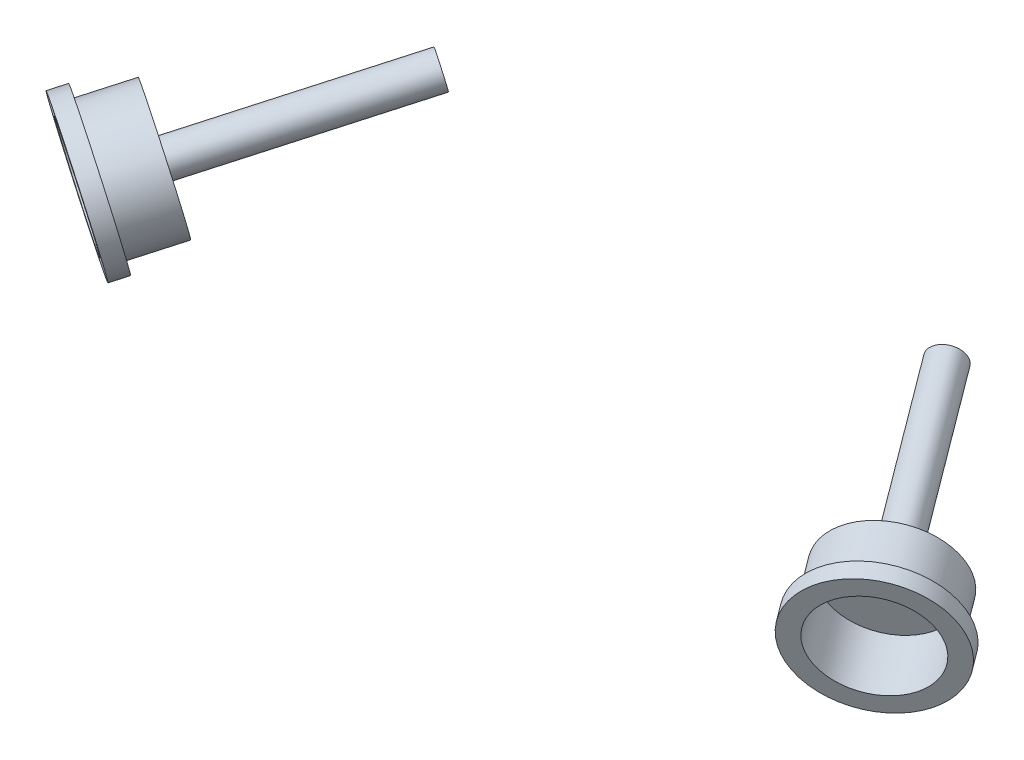
ISO-10303-21;
HEADER;
FILE_DESCRIPTION(('STEP AP214'),'2;1');
FILE_NAME('part.step','',(''),(''),'','','');
FILE_SCHEMA(('AUTOMOTIVE_DESIGN { 1 0 10303 214 1 1 1 1 }'));
ENDSEC;
DATA;
#1=APPLICATION_CONTEXT('core data for automotive mechanical design processes');
#2=APPLICATION_PROTOCOL_DEFINITION('international standard','automotive_design',2000,#1);
#3=PRODUCT_CONTEXT('',#1,'mechanical');
#4=PRODUCT('Part','Part','',(#3));
#5=PRODUCT_RELATED_PRODUCT_CATEGORY('part','',(#4));
#6=PRODUCT_DEFINITION_FORMATION('','',#4);
#7=PRODUCT_DEFINITION_CONTEXT('part definition',#1,'design');
#8=PRODUCT_DEFINITION('design','',#6,#7);
#9=PRODUCT_DEFINITION_SHAPE('','',#8);
#10=(LENGTH_UNIT() NAMED_UNIT(*) SI_UNIT(.MILLI.,.METRE.));
#11=(NAMED_UNIT(*) PLANE_ANGLE_UNIT() SI_UNIT($,.RADIAN.));
#12=(NAMED_UNIT(*) SI_UNIT($,.STERADIAN.) SOLID_ANGLE_UNIT());
#13=UNCERTAINTY_MEASURE_WITH_UNIT(LENGTH_MEASURE(1.E-05),#10,'distance_accuracy_value','');
#14=(GEOMETRIC_REPRESENTATION_CONTEXT(3) GLOBAL_UNCERTAINTY_ASSIGNED_CONTEXT((#13)) GLOBAL_UNIT_ASSIGNED_CONTEXT((#10,
#11,#12)) REPRESENTATION_CONTEXT('',''));
#15=CARTESIAN_POINT('',(0.,0.,0.));
#16=DIRECTION('',(0.,0.,1.));
#17=DIRECTION('',(1.,0.,0.));
#18=AXIS2_PLACEMENT_3D('',#15,#16,#17);
#19=CARTESIAN_POINT('',(7.10329401750734,-3.17987861259268,10.6383531296635));
#20=DIRECTION('',(0.538897500357627,-0.241244221560213,0.807087795516763));
#21=DIRECTION('',(-0.0886985432402282,0.936537053099896,0.339162080129877));
#22=AXIS2_PLACEMENT_3D('',#19,#20,#21);
#23=CYLINDRICAL_SURFACE('',#22,0.26);
#24=CARTESIAN_POINT('',(4.50041909078,-2.01466902245686,6.74011907731756));
#25=DIRECTION('',(0.538897500357627,-0.241244221560213,0.807087795516763));
#26=DIRECTION('',(-0.0886985432402282,0.936537053099896,0.339162080129877));
#27=AXIS2_PLACEMENT_3D('',#24,#25,#26);
#28=CIRCLE('',#27,0.26);
#29=CARTESIAN_POINT('',(4.47735746953754,-1.77116938865088,6.82830121815133));
#30=VERTEX_POINT('',#29);
#31=EDGE_CURVE('P0_E10',#30,#30,#28,.T.);
#32=ORIENTED_EDGE('',*,*,#31,.F.);
#33=EDGE_LOOP('',(#32));
#34=FACE_BOUND('',#33,.T.);
#35=CARTESIAN_POINT('',(6.55361856714256,-2.93380950660127,9.81512357823643));
#36=DIRECTION('',(0.538897500357627,-0.241244221560213,0.807087795516763));
#37=DIRECTION('',(-0.0886985432402282,0.936537053099896,0.339162080129877));
#38=AXIS2_PLACEMENT_3D('',#35,#36,#37);
#39=CIRCLE('',#38,0.26);
#40=CARTESIAN_POINT('',(6.5305569459001,-2.69030987279529,9.9033057190702));
#41=VERTEX_POINT('',#40);
#42=EDGE_CURVE('P0_E49',#41,#41,#39,.T.);
#43=ORIENTED_EDGE('',*,*,#42,.T.);
#44=EDGE_LOOP('',(#43));
#45=FACE_BOUND('',#44,.T.);
#46=ADVANCED_FACE('P0_F15',(#34,#45),#23,.F.);
#47=CARTESIAN_POINT('',(4.52348071202246,-2.25816865626283,6.65193693648379));
#48=DIRECTION('',(0.538897500357627,-0.241244221560213,0.807087795516763));
#49=DIRECTION('',(-0.0886985432402282,0.936537053099896,0.339162080129877));
#50=AXIS2_PLACEMENT_3D('',#47,#48,#49);
#51=PLANE('',#50);
#52=CARTESIAN_POINT('',(4.50041909078,-2.01466902245686,6.74011907731756));
#53=DIRECTION('',(0.538897500357627,-0.241244221560213,0.807087795516763));
#54=DIRECTION('',(-0.0886985432402282,0.936537053099896,0.339162080129877));
#55=AXIS2_PLACEMENT_3D('',#52,#53,#54);
#56=CIRCLE('',#55,0.3);
#57=CARTESIAN_POINT('',(4.47380952780793,-1.73370790652689,6.84186770135653));
#58=VERTEX_POINT('',#57);
#59=EDGE_CURVE('P0_E21',#58,#58,#56,.T.);
#60=ORIENTED_EDGE('',*,*,#59,.F.);
#61=EDGE_LOOP('',(#60));
#62=FACE_BOUND('',#61,.T.);
#63=ORIENTED_EDGE('',*,*,#31,.T.);
#64=EDGE_LOOP('',(#63));
#65=FACE_BOUND('',#64,.T.);
#66=ADVANCED_FACE('P0_F98',(#62,#65),#51,.F.);
#67=CARTESIAN_POINT('',(7.10329401750734,-3.17987861259268,10.6383531296635));
#68=DIRECTION('',(0.538897500357627,-0.241244221560213,0.807087795516763));
#69=DIRECTION('',(-0.0886985432402282,0.936537053099896,0.339162080129877));
#70=AXIS2_PLACEMENT_3D('',#67,#68,#69);
#71=CYLINDRICAL_SURFACE('',#70,0.3);
#72=CARTESIAN_POINT('',(6.47817291709249,-2.90003531558284,9.70213128686408));
#73=DIRECTION('',(0.538897500357627,-0.241244221560213,0.807087795516763));
#74=DIRECTION('',(-0.0886985432402282,0.936537053099896,0.339162080129877));
#75=AXIS2_PLACEMENT_3D('',#72,#73,#74);
#76=CIRCLE('',#75,0.3);
#77=CARTESIAN_POINT('',(6.45156335412042,-2.61907419965287,9.80387991090305));
#78=VERTEX_POINT('',#77);
#79=EDGE_CURVE('P0_E25',#78,#78,#76,.T.);
#80=ORIENTED_EDGE('',*,*,#79,.F.);
#81=EDGE_LOOP('',(#80));
#82=FACE_BOUND('',#81,.T.);
#83=ORIENTED_EDGE('',*,*,#59,.T.);
#84=EDGE_LOOP('',(#83));
#85=FACE_BOUND('',#84,.T.);
#86=ADVANCED_FACE('P0_F93',(#82,#85),#71,.T.);
#87=CARTESIAN_POINT('',(6.50478248006456,-3.18099643151281,9.60038266282512));
#88=DIRECTION('',(0.538897500357627,-0.241244221560213,0.807087795516763));
#89=DIRECTION('',(-0.0886985432402282,0.936537053099896,0.339162080129877));
#90=AXIS2_PLACEMENT_3D('',#87,#88,#89);
#91=PLANE('',#90);
#92=CARTESIAN_POINT('',(6.47817291709249,-2.90003531558284,9.70213128686408));
#93=DIRECTION('',(0.538897500357627,-0.241244221560213,0.807087795516763));
#94=DIRECTION('',(-0.0886985432402282,0.936537053099896,0.339162080129877));
#95=AXIS2_PLACEMENT_3D('',#92,#93,#94);
#96=CIRCLE('',#95,1.08);
#97=CARTESIAN_POINT('',(6.38237849039304,-1.88857529823495,10.0684263334044));
#98=VERTEX_POINT('',#97);
#99=EDGE_CURVE('P0_E29',#98,#98,#96,.T.);
#100=ORIENTED_EDGE('',*,*,#99,.F.);
#101=EDGE_LOOP('',(#100));
#102=FACE_BOUND('',#101,.T.);
#103=ORIENTED_EDGE('',*,*,#79,.T.);
#104=EDGE_LOOP('',(#103));
#105=FACE_BOUND('',#104,.T.);
#106=ADVANCED_FACE('P0_F87',(#102,#105),#91,.F.);
#107=CARTESIAN_POINT('',(7.10329401750734,-3.17987861259268,10.6383531296635));
#108=DIRECTION('',(0.538897500357627,-0.241244221560213,0.807087795516763));
#109=DIRECTION('',(-0.0886985432402282,0.936537053099896,0.339162080129877));
#110=AXIS2_PLACEMENT_3D('',#107,#108,#109);
#111=CYLINDRICAL_SURFACE('',#110,1.08);
#112=CARTESIAN_POINT('',(6.94162476740005,-3.10750534612462,10.3962267910085));
#113=DIRECTION('',(0.538897500357627,-0.241244221560213,0.807087795516763));
#114=DIRECTION('',(-0.0886985432402282,0.936537053099896,0.339162080129877));
#115=AXIS2_PLACEMENT_3D('',#112,#113,#114);
#116=CIRCLE('',#115,1.08);
#117=CARTESIAN_POINT('',(6.8458303407006,-2.09604532877673,10.7625218375488));
#118=VERTEX_POINT('',#117);
#119=EDGE_CURVE('P0_E34',#118,#118,#116,.T.);
#120=ORIENTED_EDGE('',*,*,#119,.F.);
#121=EDGE_LOOP('',(#120));
#122=FACE_BOUND('',#121,.T.);
#123=ORIENTED_EDGE('',*,*,#99,.T.);
#124=EDGE_LOOP('',(#123));
#125=FACE_BOUND('',#124,.T.);
#126=ADVANCED_FACE('P0_F81',(#122,#125),#111,.T.);
#127=CARTESIAN_POINT('',(7.0374191940995,-4.11896536347251,10.0299317444682));
#128=DIRECTION('',(0.538897500357627,-0.241244221560213,0.807087795516763));
#129=DIRECTION('',(-0.0886985432402282,0.936537053099896,0.339162080129877));
#130=AXIS2_PLACEMENT_3D('',#127,#128,#129);
#131=PLANE('',#130);
#132=CARTESIAN_POINT('',(6.94162476740005,-3.10750534612462,10.3962267910085));
#133=DIRECTION('',(0.538897500357627,-0.241244221560213,0.807087795516763));
#134=DIRECTION('',(-0.0886985432402282,0.936537053099896,0.339162080129877));
#135=AXIS2_PLACEMENT_3D('',#132,#133,#134);
#136=CIRCLE('',#135,1.275);
#137=CARTESIAN_POINT('',(6.82853412476876,-1.91342060342225,10.8286584431741));
#138=VERTEX_POINT('',#137);
#139=EDGE_CURVE('P0_E37',#138,#138,#136,.T.);
#140=ORIENTED_EDGE('',*,*,#139,.F.);
#141=EDGE_LOOP('',(#140));
#142=FACE_BOUND('',#141,.T.);
#143=ORIENTED_EDGE('',*,*,#119,.T.);
#144=EDGE_LOOP('',(#143));
#145=FACE_BOUND('',#144,.T.);
#146=ADVANCED_FACE('P0_F75',(#142,#145),#131,.F.);
#147=CARTESIAN_POINT('',(7.10329401750734,-3.17987861259268,10.6383531296635));
#148=DIRECTION('',(0.538897500357627,-0.241244221560213,0.807087795516763));
#149=DIRECTION('',(-0.0886985432402282,0.936537053099896,0.339162080129877));
#150=AXIS2_PLACEMENT_3D('',#147,#148,#149);
#151=CYLINDRICAL_SURFACE('',#150,1.275);
#152=CARTESIAN_POINT('',(7.10329401750734,-3.17987861259268,10.6383531296635));
#153=DIRECTION('',(0.538897500357627,-0.241244221560213,0.807087795516763));
#154=DIRECTION('',(-0.0886985432402282,0.936537053099896,0.339162080129877));
#155=AXIS2_PLACEMENT_3D('',#152,#153,#154);
#156=CIRCLE('',#155,1.275);
#157=CARTESIAN_POINT('',(6.99020337487605,-1.98579386989032,11.0707847818291));
#158=VERTEX_POINT('',#157);
#159=EDGE_CURVE('P0_E40',#158,#158,#156,.T.);
#160=ORIENTED_EDGE('',*,*,#159,.F.);
#161=EDGE_LOOP('',(#160));
#162=FACE_BOUND('',#161,.T.);
#163=ORIENTED_EDGE('',*,*,#139,.T.);
#164=EDGE_LOOP('',(#163));
#165=FACE_BOUND('',#164,.T.);
#166=ADVANCED_FACE('P0_F69',(#162,#165),#151,.T.);
#167=CARTESIAN_POINT('',(7.21638466013863,-4.37396335529505,10.2059214774979));
#168=DIRECTION('',(-0.538897500357627,0.241244221560213,-0.807087795516763));
#169=DIRECTION('',(0.0886985432402282,-0.936537053099896,-0.339162080129877));
#170=AXIS2_PLACEMENT_3D('',#167,#168,#169);
#171=PLANE('',#170);
#172=CARTESIAN_POINT('',(7.10329401750734,-3.17987861259268,10.6383531296635));
#173=DIRECTION('',(0.538897500357627,-0.241244221560213,0.807087795516763));
#174=DIRECTION('',(-0.0886985432402282,0.936537053099896,0.339162080129877));
#175=AXIS2_PLACEMENT_3D('',#172,#173,#174);
#176=CIRCLE('',#175,0.945);
#177=CARTESIAN_POINT('',(7.01947389414532,-2.29485109741328,10.9588612953863));
#178=VERTEX_POINT('',#177);
#179=EDGE_CURVE('P0_E43',#178,#178,#176,.T.);
#180=ORIENTED_EDGE('',*,*,#179,.F.);
#181=EDGE_LOOP('',(#180));
#182=FACE_BOUND('',#181,.T.);
#183=ORIENTED_EDGE('',*,*,#159,.T.);
#184=EDGE_LOOP('',(#183));
#185=FACE_BOUND('',#184,.T.);
#186=ADVANCED_FACE('P0_F63',(#182,#185),#171,.F.);
#187=CARTESIAN_POINT('',(7.10329401750734,-3.17987861259268,10.6383531296635));
#188=DIRECTION('',(0.538897500357627,-0.241244221560213,0.807087795516763));
#189=DIRECTION('',(-0.0886985432402282,0.936537053099896,0.339162080129877));
#190=AXIS2_PLACEMENT_3D('',#187,#188,#189);
#191=CYLINDRICAL_SURFACE('',#190,0.945);
#192=CARTESIAN_POINT('',(6.55361856714256,-2.93380950660127,9.81512357823643));
#193=DIRECTION('',(0.538897500357627,-0.241244221560213,0.807087795516763));
#194=DIRECTION('',(-0.0886985432402282,0.936537053099896,0.339162080129877));
#195=AXIS2_PLACEMENT_3D('',#192,#193,#194);
#196=CIRCLE('',#195,0.945);
#197=CARTESIAN_POINT('',(6.46979844378054,-2.04878199142187,10.1356317439592));
#198=VERTEX_POINT('',#197);
#199=EDGE_CURVE('P0_E46',#198,#198,#196,.T.);
#200=ORIENTED_EDGE('',*,*,#199,.F.);
#201=EDGE_LOOP('',(#200));
#202=FACE_BOUND('',#201,.T.);
#203=ORIENTED_EDGE('',*,*,#179,.T.);
#204=EDGE_LOOP('',(#203));
#205=FACE_BOUND('',#204,.T.);
#206=ADVANCED_FACE('P0_F57',(#202,#205),#191,.F.);
#207=CARTESIAN_POINT('',(6.63743869050457,-3.81883702178067,9.4946154125137));
#208=DIRECTION('',(-0.538897500357627,0.241244221560213,-0.807087795516763));
#209=DIRECTION('',(0.0886985432402282,-0.936537053099896,-0.339162080129877));
#210=AXIS2_PLACEMENT_3D('',#207,#208,#209);
#211=PLANE('',#210);
#212=ORIENTED_EDGE('',*,*,#42,.F.);
#213=EDGE_LOOP('',(#212));
#214=FACE_BOUND('',#213,.T.);
#215=ORIENTED_EDGE('',*,*,#199,.T.);
#216=EDGE_LOOP('',(#215));
#217=FACE_BOUND('',#216,.T.);
#218=ADVANCED_FACE('P0_F54',(#214,#217),#211,.F.);
#219=CLOSED_SHELL('',(#46,#66,#86,#106,#126,#146,#166,#186,#206,#218));
#220=MANIFOLD_SOLID_BREP('P0_B1',#219);
#221=CARTESIAN_POINT('',(-7.11266514827799,-3.18407371675702,10.6523879419797));
#222=DIRECTION('',(-0.538897500357627,-0.241244221560212,0.807087795516763));
#223=DIRECTION('',(-0.234853213870572,-0.877095865970433,-0.418983066283401));
#224=AXIS2_PLACEMENT_3D('',#221,#222,#223);
#225=CYLINDRICAL_SURFACE('',#224,0.26);
#226=CARTESIAN_POINT('',(-4.50979022155065,-2.0188641266212,6.75415388963375));
#227=DIRECTION('',(-0.538897500357627,-0.241244221560212,0.807087795516763));
#228=DIRECTION('',(-0.234853213870572,-0.877095865970433,-0.418983066283401));
#229=AXIS2_PLACEMENT_3D('',#226,#227,#228);
#230=CIRCLE('',#229,0.26);
#231=CARTESIAN_POINT('',(-4.570852057157,-2.24690905177351,6.64521829240006));
#232=VERTEX_POINT('',#231);
#233=EDGE_CURVE('P1_E9',#232,#232,#230,.T.);
#234=ORIENTED_EDGE('',*,*,#233,.F.);
#235=EDGE_LOOP('',(#234));
#236=FACE_BOUND('',#235,.T.);
#237=CARTESIAN_POINT('',(-6.56298969791321,-2.93800461076561,9.82915839055262));
#238=DIRECTION('',(-0.538897500357627,-0.241244221560212,0.807087795516763));
#239=DIRECTION('',(-0.234853213870572,-0.877095865970433,-0.418983066283401));
#240=AXIS2_PLACEMENT_3D('',#237,#238,#239);
#241=CIRCLE('',#240,0.26);
#242=CARTESIAN_POINT('',(-6.62405153351956,-3.16604953591792,9.72022279331893));
#243=VERTEX_POINT('',#242);
#244=EDGE_CURVE('P1_E48',#243,#243,#241,.T.);
#245=ORIENTED_EDGE('',*,*,#244,.T.);
#246=EDGE_LOOP('',(#245));
#247=FACE_BOUND('',#246,.T.);
#248=ADVANCED_FACE('P1_F14',(#236,#247),#225,.F.);
#249=CARTESIAN_POINT('',(-4.4487283859443,-1.79081920146889,6.86308948686743));
#250=DIRECTION('',(-0.538897500357627,-0.241244221560212,0.807087795516763));
#251=DIRECTION('',(-0.234853213870572,-0.877095865970433,-0.418983066283401));
#252=AXIS2_PLACEMENT_3D('',#249,#250,#251);
#253=PLANE('',#252);
#254=CARTESIAN_POINT('',(-4.50979022155065,-2.0188641266212,6.75415388963375));
#255=DIRECTION('',(-0.538897500357627,-0.241244221560212,0.807087795516763));
#256=DIRECTION('',(-0.234853213870572,-0.877095865970433,-0.418983066283401));
#257=AXIS2_PLACEMENT_3D('',#254,#255,#256);
#258=CIRCLE('',#257,0.3);
#259=CARTESIAN_POINT('',(-4.58024618571182,-2.28199288641233,6.62845896974873));
#260=VERTEX_POINT('',#259);
#261=EDGE_CURVE('P1_E20',#260,#260,#258,.T.);
#262=ORIENTED_EDGE('',*,*,#261,.F.);
#263=EDGE_LOOP('',(#262));
#264=FACE_BOUND('',#263,.T.);
#265=ORIENTED_EDGE('',*,*,#233,.T.);
#266=EDGE_LOOP('',(#265));
#267=FACE_BOUND('',#266,.T.);
#268=ADVANCED_FACE('P1_F97',(#264,#267),#253,.F.);
#269=CARTESIAN_POINT('',(-7.11266514827799,-3.18407371675702,10.6523879419797));
#270=DIRECTION('',(-0.538897500357627,-0.241244221560212,0.807087795516763));
#271=DIRECTION('',(-0.234853213870572,-0.877095865970433,-0.418983066283401));
#272=AXIS2_PLACEMENT_3D('',#269,#270,#271);
#273=CYLINDRICAL_SURFACE('',#272,0.3);
#274=CARTESIAN_POINT('',(-6.48754404786314,-2.90423041974718,9.71616609918027));
#275=DIRECTION('',(-0.538897500357627,-0.241244221560212,0.807087795516763));
#276=DIRECTION('',(-0.234853213870572,-0.877095865970433,-0.418983066283401));
#277=AXIS2_PLACEMENT_3D('',#274,#275,#276);
#278=CIRCLE('',#277,0.3);
#279=CARTESIAN_POINT('',(-6.55800001202431,-3.16735917953831,9.59047117929525));
#280=VERTEX_POINT('',#279);
#281=EDGE_CURVE('P1_E24',#280,#280,#278,.T.);
#282=ORIENTED_EDGE('',*,*,#281,.F.);
#283=EDGE_LOOP('',(#282));
#284=FACE_BOUND('',#283,.T.);
#285=ORIENTED_EDGE('',*,*,#261,.T.);
#286=EDGE_LOOP('',(#285));
#287=FACE_BOUND('',#286,.T.);
#288=ADVANCED_FACE('P1_F92',(#284,#287),#273,.T.);
#289=CARTESIAN_POINT('',(-6.41708808370197,-2.64110165995605,9.84186101906529));
#290=DIRECTION('',(-0.538897500357627,-0.241244221560212,0.807087795516763));
#291=DIRECTION('',(-0.234853213870572,-0.877095865970433,-0.418983066283401));
#292=AXIS2_PLACEMENT_3D('',#289,#290,#291);
#293=PLANE('',#292);
#294=CARTESIAN_POINT('',(-6.48754404786314,-2.90423041974718,9.71616609918027));
#295=DIRECTION('',(-0.538897500357627,-0.241244221560212,0.807087795516763));
#296=DIRECTION('',(-0.234853213870572,-0.877095865970433,-0.418983066283401));
#297=AXIS2_PLACEMENT_3D('',#294,#295,#296);
#298=CIRCLE('',#297,1.08);
#299=CARTESIAN_POINT('',(-6.74118551884336,-3.85149395499525,9.2636643875942));
#300=VERTEX_POINT('',#299);
#301=EDGE_CURVE('P1_E28',#300,#300,#298,.T.);
#302=ORIENTED_EDGE('',*,*,#301,.F.);
#303=EDGE_LOOP('',(#302));
#304=FACE_BOUND('',#303,.T.);
#305=ORIENTED_EDGE('',*,*,#281,.T.);
#306=EDGE_LOOP('',(#305));
#307=FACE_BOUND('',#306,.T.);
#308=ADVANCED_FACE('P1_F86',(#304,#307),#293,.F.);
#309=CARTESIAN_POINT('',(-7.11266514827799,-3.18407371675702,10.6523879419797));
#310=DIRECTION('',(-0.538897500357627,-0.241244221560212,0.807087795516763));
#311=DIRECTION('',(-0.234853213870572,-0.877095865970433,-0.418983066283401));
#312=AXIS2_PLACEMENT_3D('',#309,#310,#311);
#313=CYLINDRICAL_SURFACE('',#312,1.08);
#314=CARTESIAN_POINT('',(-6.9509958981707,-3.11170045028896,10.4102616033247));
#315=DIRECTION('',(-0.538897500357627,-0.241244221560212,0.807087795516763));
#316=DIRECTION('',(-0.234853213870572,-0.877095865970433,-0.418983066283401));
#317=AXIS2_PLACEMENT_3D('',#314,#315,#316);
#318=CIRCLE('',#317,1.08);
#319=CARTESIAN_POINT('',(-7.20463736915092,-4.05896398553703,9.95775989173861));
#320=VERTEX_POINT('',#319);
#321=EDGE_CURVE('P1_E33',#320,#320,#318,.T.);
#322=ORIENTED_EDGE('',*,*,#321,.F.);
#323=EDGE_LOOP('',(#322));
#324=FACE_BOUND('',#323,.T.);
#325=ORIENTED_EDGE('',*,*,#301,.T.);
#326=EDGE_LOOP('',(#325));
#327=FACE_BOUND('',#326,.T.);
#328=ADVANCED_FACE('P1_F80',(#324,#327),#313,.T.);
#329=CARTESIAN_POINT('',(-6.69735442719048,-2.16443691504089,10.8627633149108));
#330=DIRECTION('',(-0.538897500357627,-0.241244221560212,0.807087795516763));
#331=DIRECTION('',(-0.234853213870572,-0.877095865970433,-0.418983066283401));
#332=AXIS2_PLACEMENT_3D('',#329,#330,#331);
#333=PLANE('',#332);
#334=CARTESIAN_POINT('',(-6.9509958981707,-3.11170045028896,10.4102616033247));
#335=DIRECTION('',(-0.538897500357627,-0.241244221560212,0.807087795516763));
#336=DIRECTION('',(-0.234853213870572,-0.877095865970433,-0.418983066283401));
#337=AXIS2_PLACEMENT_3D('',#334,#335,#336);
#338=CIRCLE('',#337,1.275);
#339=CARTESIAN_POINT('',(-7.25043374585568,-4.22999767940126,9.87605819381335));
#340=VERTEX_POINT('',#339);
#341=EDGE_CURVE('P1_E36',#340,#340,#338,.T.);
#342=ORIENTED_EDGE('',*,*,#341,.F.);
#343=EDGE_LOOP('',(#342));
#344=FACE_BOUND('',#343,.T.);
#345=ORIENTED_EDGE('',*,*,#321,.T.);
#346=EDGE_LOOP('',(#345));
#347=FACE_BOUND('',#346,.T.);
#348=ADVANCED_FACE('P1_F74',(#344,#347),#333,.F.);
#349=CARTESIAN_POINT('',(-7.11266514827799,-3.18407371675702,10.6523879419797));
#350=DIRECTION('',(-0.538897500357627,-0.241244221560212,0.807087795516763));
#351=DIRECTION('',(-0.234853213870572,-0.877095865970433,-0.418983066283401));
#352=AXIS2_PLACEMENT_3D('',#349,#350,#351);
#353=CYLINDRICAL_SURFACE('',#352,1.275);
#354=CARTESIAN_POINT('',(-7.11266514827799,-3.18407371675702,10.6523879419797));
#355=DIRECTION('',(-0.538897500357627,-0.241244221560212,0.807087795516763));
#356=DIRECTION('',(-0.234853213870572,-0.877095865970433,-0.418983066283401));
#357=AXIS2_PLACEMENT_3D('',#354,#355,#356);
#358=CIRCLE('',#357,1.275);
#359=CARTESIAN_POINT('',(-7.41210299596297,-4.30237094586933,10.1181845324684));
#360=VERTEX_POINT('',#359);
#361=EDGE_CURVE('P1_E39',#360,#360,#358,.T.);
#362=ORIENTED_EDGE('',*,*,#361,.F.);
#363=EDGE_LOOP('',(#362));
#364=FACE_BOUND('',#363,.T.);
#365=ORIENTED_EDGE('',*,*,#341,.T.);
#366=EDGE_LOOP('',(#365));
#367=FACE_BOUND('',#366,.T.);
#368=ADVANCED_FACE('P1_F68',(#364,#367),#353,.T.);
#369=CARTESIAN_POINT('',(-6.81322730059301,-2.06577648764472,11.1865913514911));
#370=DIRECTION('',(0.538897500357627,0.241244221560212,-0.807087795516763));
#371=DIRECTION('',(0.234853213870572,0.877095865970433,0.418983066283401));
#372=AXIS2_PLACEMENT_3D('',#369,#370,#371);
#373=PLANE('',#372);
#374=CARTESIAN_POINT('',(-7.11266514827799,-3.18407371675702,10.6523879419797));
#375=DIRECTION('',(-0.538897500357627,-0.241244221560212,0.807087795516763));
#376=DIRECTION('',(-0.234853213870572,-0.877095865970433,-0.418983066283401));
#377=AXIS2_PLACEMENT_3D('',#374,#375,#376);
#378=CIRCLE('',#377,0.945);
#379=CARTESIAN_POINT('',(-7.33460143538568,-4.01292931009908,10.2564489443419));
#380=VERTEX_POINT('',#379);
#381=EDGE_CURVE('P1_E42',#380,#380,#378,.T.);
#382=ORIENTED_EDGE('',*,*,#381,.F.);
#383=EDGE_LOOP('',(#382));
#384=FACE_BOUND('',#383,.T.);
#385=ORIENTED_EDGE('',*,*,#361,.T.);
#386=EDGE_LOOP('',(#385));
#387=FACE_BOUND('',#386,.T.);
#388=ADVANCED_FACE('P1_F62',(#384,#387),#373,.F.);
#389=CARTESIAN_POINT('',(-7.11266514827799,-3.18407371675702,10.6523879419797));
#390=DIRECTION('',(-0.538897500357627,-0.241244221560212,0.807087795516763));
#391=DIRECTION('',(-0.234853213870572,-0.877095865970433,-0.418983066283401));
#392=AXIS2_PLACEMENT_3D('',#389,#390,#391);
#393=CYLINDRICAL_SURFACE('',#392,0.945);
#394=CARTESIAN_POINT('',(-6.56298969791321,-2.93800461076561,9.82915839055262));
#395=DIRECTION('',(-0.538897500357627,-0.241244221560212,0.807087795516763));
#396=DIRECTION('',(-0.234853213870572,-0.877095865970433,-0.418983066283401));
#397=AXIS2_PLACEMENT_3D('',#394,#395,#396);
#398=CIRCLE('',#397,0.945);
#399=CARTESIAN_POINT('',(-6.7849259850209,-3.76686020410767,9.4332193929148));
#400=VERTEX_POINT('',#399);
#401=EDGE_CURVE('P1_E45',#400,#400,#398,.T.);
#402=ORIENTED_EDGE('',*,*,#401,.F.);
#403=EDGE_LOOP('',(#402));
#404=FACE_BOUND('',#403,.T.);
#405=ORIENTED_EDGE('',*,*,#381,.T.);
#406=EDGE_LOOP('',(#405));
#407=FACE_BOUND('',#406,.T.);
#408=ADVANCED_FACE('P1_F56',(#404,#407),#393,.F.);
#409=CARTESIAN_POINT('',(-6.34105341080552,-2.10914901742355,10.2250973881904));
#410=DIRECTION('',(0.538897500357627,0.241244221560212,-0.807087795516763));
#411=DIRECTION('',(0.234853213870572,0.877095865970433,0.418983066283401));
#412=AXIS2_PLACEMENT_3D('',#409,#410,#411);
#413=PLANE('',#412);
#414=ORIENTED_EDGE('',*,*,#244,.F.);
#415=EDGE_LOOP('',(#414));
#416=FACE_BOUND('',#415,.T.);
#417=ORIENTED_EDGE('',*,*,#401,.T.);
#418=EDGE_LOOP('',(#417));
#419=FACE_BOUND('',#418,.T.);
#420=ADVANCED_FACE('P1_F53',(#416,#419),#413,.F.);
#421=CLOSED_SHELL('',(#248,#268,#288,#308,#328,#348,#368,#388,#408,#420));
#422=MANIFOLD_SOLID_BREP('P1_B1',#421);
#423=ADVANCED_BREP_SHAPE_REPRESENTATION('',(#18,#220,#422),#14);
#424=SHAPE_DEFINITION_REPRESENTATION(#9,#423);
ENDSEC;
END-ISO-10303-21;
